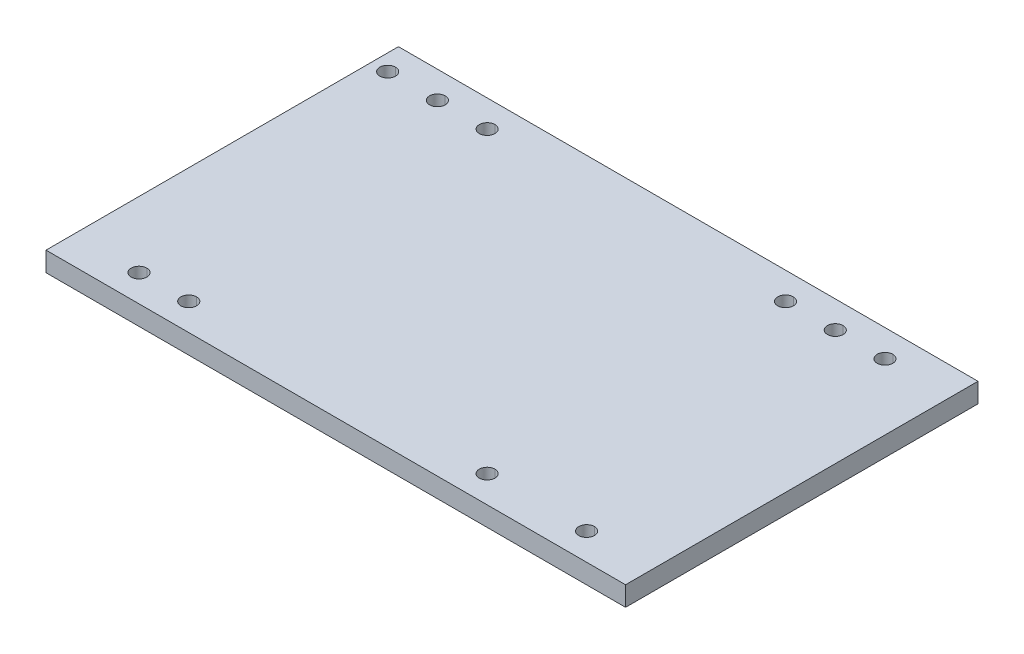
ISO-10303-21;
HEADER;
FILE_DESCRIPTION(('STEP AP214'),'2;1');
FILE_NAME('part.step','',(''),(''),'','','');
FILE_SCHEMA(('AUTOMOTIVE_DESIGN { 1 0 10303 214 1 1 1 1 }'));
ENDSEC;
DATA;
#1=APPLICATION_CONTEXT('core data for automotive mechanical design processes');
#2=APPLICATION_PROTOCOL_DEFINITION('international standard','automotive_design',2000,#1);
#3=PRODUCT_CONTEXT('',#1,'mechanical');
#4=PRODUCT('Part','Part','',(#3));
#5=PRODUCT_RELATED_PRODUCT_CATEGORY('part','',(#4));
#6=PRODUCT_DEFINITION_FORMATION('','',#4);
#7=PRODUCT_DEFINITION_CONTEXT('part definition',#1,'design');
#8=PRODUCT_DEFINITION('design','',#6,#7);
#9=PRODUCT_DEFINITION_SHAPE('','',#8);
#10=(LENGTH_UNIT() NAMED_UNIT(*) SI_UNIT(.MILLI.,.METRE.));
#11=(NAMED_UNIT(*) PLANE_ANGLE_UNIT() SI_UNIT($,.RADIAN.));
#12=(NAMED_UNIT(*) SI_UNIT($,.STERADIAN.) SOLID_ANGLE_UNIT());
#13=UNCERTAINTY_MEASURE_WITH_UNIT(LENGTH_MEASURE(1.E-05),#10,'distance_accuracy_value','');
#14=(GEOMETRIC_REPRESENTATION_CONTEXT(3) GLOBAL_UNCERTAINTY_ASSIGNED_CONTEXT((#13)) GLOBAL_UNIT_ASSIGNED_CONTEXT((#10,
#11,#12)) REPRESENTATION_CONTEXT('',''));
#15=CARTESIAN_POINT('',(0.,0.,0.));
#16=DIRECTION('',(0.,0.,1.));
#17=DIRECTION('',(1.,0.,0.));
#18=AXIS2_PLACEMENT_3D('',#15,#16,#17);
#19=CARTESIAN_POINT('',(-13.97,-9.,-7.62));
#20=DIRECTION('',(0.,1.,0.));
#21=DIRECTION('',(0.,0.,1.));
#22=AXIS2_PLACEMENT_3D('',#19,#20,#21);
#23=CYLINDRICAL_SURFACE('',#22,0.4);
#24=DIRECTION('',(0.,1.,0.));
#25=VECTOR('',#24,1.);
#26=CARTESIAN_POINT('',(-13.97,-9.,-8.02));
#27=LINE('',#26,#25);
#28=CARTESIAN_POINT('',(-13.97,0.,-8.02));
#29=VERTEX_POINT('',#28);
#30=CARTESIAN_POINT('',(-13.97,1.,-8.02));
#31=VERTEX_POINT('',#30);
#32=EDGE_CURVE('E486',#29,#31,#27,.T.);
#33=ORIENTED_EDGE('',*,*,#32,.F.);
#34=CARTESIAN_POINT('',(-13.97,0.,-7.62));
#35=DIRECTION('',(0.,1.,0.));
#36=DIRECTION('',(0.,0.,1.));
#37=AXIS2_PLACEMENT_3D('',#34,#35,#36);
#38=CIRCLE('',#37,0.4);
#39=CARTESIAN_POINT('',(-13.97,0.,-7.22));
#40=VERTEX_POINT('',#39);
#41=EDGE_CURVE('E409',#40,#29,#38,.T.);
#42=ORIENTED_EDGE('',*,*,#41,.F.);
#43=DIRECTION('',(0.,1.,0.));
#44=VECTOR('',#43,1.);
#45=CARTESIAN_POINT('',(-13.97,-9.,-7.22));
#46=LINE('',#45,#44);
#47=CARTESIAN_POINT('',(-13.97,1.,-7.22));
#48=VERTEX_POINT('',#47);
#49=EDGE_CURVE('E494',#40,#48,#46,.T.);
#50=ORIENTED_EDGE('',*,*,#49,.T.);
#51=CARTESIAN_POINT('',(-13.97,1.,-7.62));
#52=DIRECTION('',(0.,1.,0.));
#53=DIRECTION('',(0.,0.,1.));
#54=AXIS2_PLACEMENT_3D('',#51,#52,#53);
#55=CIRCLE('',#54,0.4);
#56=EDGE_CURVE('E20',#48,#31,#55,.T.);
#57=ORIENTED_EDGE('',*,*,#56,.T.);
#58=EDGE_LOOP('',(#33,#42,#50,#57));
#59=FACE_BOUND('',#58,.T.);
#60=ADVANCED_FACE('F17',(#59),#23,.F.);
#61=CARTESIAN_POINT('',(8.89,-9.,-7.62));
#62=DIRECTION('',(0.,1.,0.));
#63=DIRECTION('',(0.,0.,1.));
#64=AXIS2_PLACEMENT_3D('',#61,#62,#63);
#65=CYLINDRICAL_SURFACE('',#64,0.4);
#66=DIRECTION('',(0.,1.,0.));
#67=VECTOR('',#66,1.);
#68=CARTESIAN_POINT('',(8.89,-9.,-8.02));
#69=LINE('',#68,#67);
#70=CARTESIAN_POINT('',(8.89,0.,-8.02));
#71=VERTEX_POINT('',#70);
#72=CARTESIAN_POINT('',(8.89,1.,-8.02));
#73=VERTEX_POINT('',#72);
#74=EDGE_CURVE('E493',#71,#73,#69,.T.);
#75=ORIENTED_EDGE('',*,*,#74,.F.);
#76=CARTESIAN_POINT('',(8.89,0.,-7.62));
#77=DIRECTION('',(0.,1.,0.));
#78=DIRECTION('',(0.,0.,1.));
#79=AXIS2_PLACEMENT_3D('',#76,#77,#78);
#80=CIRCLE('',#79,0.4);
#81=CARTESIAN_POINT('',(8.89,0.,-7.22));
#82=VERTEX_POINT('',#81);
#83=EDGE_CURVE('E412',#82,#71,#80,.T.);
#84=ORIENTED_EDGE('',*,*,#83,.F.);
#85=DIRECTION('',(0.,1.,0.));
#86=VECTOR('',#85,1.);
#87=CARTESIAN_POINT('',(8.89,-9.,-7.22));
#88=LINE('',#87,#86);
#89=CARTESIAN_POINT('',(8.89,1.,-7.22));
#90=VERTEX_POINT('',#89);
#91=EDGE_CURVE('E264',#82,#90,#88,.T.);
#92=ORIENTED_EDGE('',*,*,#91,.T.);
#93=CARTESIAN_POINT('',(8.89,1.,-7.62));
#94=DIRECTION('',(0.,1.,0.));
#95=DIRECTION('',(0.,0.,1.));
#96=AXIS2_PLACEMENT_3D('',#93,#94,#95);
#97=CIRCLE('',#96,0.4);
#98=EDGE_CURVE('E11',#90,#73,#97,.T.);
#99=ORIENTED_EDGE('',*,*,#98,.T.);
#100=EDGE_LOOP('',(#75,#84,#92,#99));
#101=FACE_BOUND('',#100,.T.);
#102=ADVANCED_FACE('F518',(#101),#65,.F.);
#103=CARTESIAN_POINT('',(0.,1.,0.));
#104=DIRECTION('',(0.,1.,0.));
#105=DIRECTION('',(1.,0.,0.));
#106=AXIS2_PLACEMENT_3D('',#103,#104,#105);
#107=PLANE('',#106);
#108=DIRECTION('',(1.,0.,0.));
#109=VECTOR('',#108,1.);
#110=CARTESIAN_POINT('',(14.8,1.,-9.));
#111=LINE('',#110,#109);
#112=CARTESIAN_POINT('',(-14.8,1.,-9.));
#113=VERTEX_POINT('',#112);
#114=CARTESIAN_POINT('',(14.8,1.,-9.));
#115=VERTEX_POINT('',#114);
#116=EDGE_CURVE('E302',#113,#115,#111,.T.);
#117=ORIENTED_EDGE('',*,*,#116,.F.);
#118=DIRECTION('',(0.,0.,-1.));
#119=VECTOR('',#118,1.);
#120=CARTESIAN_POINT('',(-14.8,1.,-9.));
#121=LINE('',#120,#119);
#122=CARTESIAN_POINT('',(-14.8,1.,9.));
#123=VERTEX_POINT('',#122);
#124=EDGE_CURVE('E38',#123,#113,#121,.T.);
#125=ORIENTED_EDGE('',*,*,#124,.F.);
#126=DIRECTION('',(-1.,0.,0.));
#127=VECTOR('',#126,1.);
#128=CARTESIAN_POINT('',(-14.8,1.,9.));
#129=LINE('',#128,#127);
#130=CARTESIAN_POINT('',(14.8,1.,9.));
#131=VERTEX_POINT('',#130);
#132=EDGE_CURVE('E44',#131,#123,#129,.T.);
#133=ORIENTED_EDGE('',*,*,#132,.F.);
#134=DIRECTION('',(0.,0.,1.));
#135=VECTOR('',#134,1.);
#136=CARTESIAN_POINT('',(14.8,1.,9.));
#137=LINE('',#136,#135);
#138=EDGE_CURVE('E452',#115,#131,#137,.T.);
#139=ORIENTED_EDGE('',*,*,#138,.F.);
#140=EDGE_LOOP('',(#117,#125,#133,#139));
#141=FACE_BOUND('',#140,.T.);
#142=CARTESIAN_POINT('',(-11.43,1.,7.62));
#143=DIRECTION('',(0.,-1.,0.));
#144=DIRECTION('',(0.,0.,1.));
#145=AXIS2_PLACEMENT_3D('',#142,#143,#144);
#146=CIRCLE('',#145,0.4);
#147=CARTESIAN_POINT('',(-11.43,1.,8.02));
#148=VERTEX_POINT('',#147);
#149=CARTESIAN_POINT('',(-11.43,1.,7.22));
#150=VERTEX_POINT('',#149);
#151=EDGE_CURVE('E401',#148,#150,#146,.T.);
#152=ORIENTED_EDGE('',*,*,#151,.T.);
#153=CARTESIAN_POINT('',(-11.43,1.,7.62));
#154=DIRECTION('',(0.,-1.,0.));
#155=DIRECTION('',(0.,0.,1.));
#156=AXIS2_PLACEMENT_3D('',#153,#154,#155);
#157=CIRCLE('',#156,0.4);
#158=EDGE_CURVE('E427',#150,#148,#157,.T.);
#159=ORIENTED_EDGE('',*,*,#158,.T.);
#160=EDGE_LOOP('',(#152,#159));
#161=FACE_BOUND('',#160,.T.);
#162=CARTESIAN_POINT('',(-8.89,1.,7.62));
#163=DIRECTION('',(0.,-1.,0.));
#164=DIRECTION('',(0.,0.,1.));
#165=AXIS2_PLACEMENT_3D('',#162,#163,#164);
#166=CIRCLE('',#165,0.4);
#167=CARTESIAN_POINT('',(-8.89,1.,8.02));
#168=VERTEX_POINT('',#167);
#169=CARTESIAN_POINT('',(-8.89,1.,7.22));
#170=VERTEX_POINT('',#169);
#171=EDGE_CURVE('E296',#168,#170,#166,.T.);
#172=ORIENTED_EDGE('',*,*,#171,.T.);
#173=CARTESIAN_POINT('',(-8.89,1.,7.62));
#174=DIRECTION('',(0.,-1.,0.));
#175=DIRECTION('',(0.,0.,1.));
#176=AXIS2_PLACEMENT_3D('',#173,#174,#175);
#177=CIRCLE('',#176,0.4);
#178=EDGE_CURVE('E425',#170,#168,#177,.T.);
#179=ORIENTED_EDGE('',*,*,#178,.T.);
#180=EDGE_LOOP('',(#172,#179));
#181=FACE_BOUND('',#180,.T.);
#182=CARTESIAN_POINT('',(6.35,1.,7.62));
#183=DIRECTION('',(0.,-1.,0.));
#184=DIRECTION('',(0.,0.,1.));
#185=AXIS2_PLACEMENT_3D('',#182,#183,#184);
#186=CIRCLE('',#185,0.4);
#187=CARTESIAN_POINT('',(6.35,1.,8.02));
#188=VERTEX_POINT('',#187);
#189=CARTESIAN_POINT('',(6.35,1.,7.22));
#190=VERTEX_POINT('',#189);
#191=EDGE_CURVE('E376',#188,#190,#186,.T.);
#192=ORIENTED_EDGE('',*,*,#191,.T.);
#193=CARTESIAN_POINT('',(6.35,1.,7.62));
#194=DIRECTION('',(0.,-1.,0.));
#195=DIRECTION('',(0.,0.,1.));
#196=AXIS2_PLACEMENT_3D('',#193,#194,#195);
#197=CIRCLE('',#196,0.4);
#198=EDGE_CURVE('E428',#190,#188,#197,.T.);
#199=ORIENTED_EDGE('',*,*,#198,.T.);
#200=EDGE_LOOP('',(#192,#199));
#201=FACE_BOUND('',#200,.T.);
#202=CARTESIAN_POINT('',(11.43,1.,7.62));
#203=DIRECTION('',(0.,-1.,0.));
#204=DIRECTION('',(0.,0.,1.));
#205=AXIS2_PLACEMENT_3D('',#202,#203,#204);
#206=CIRCLE('',#205,0.4);
#207=CARTESIAN_POINT('',(11.43,1.,8.02));
#208=VERTEX_POINT('',#207);
#209=CARTESIAN_POINT('',(11.43,1.,7.22));
#210=VERTEX_POINT('',#209);
#211=EDGE_CURVE('E357',#208,#210,#206,.T.);
#212=ORIENTED_EDGE('',*,*,#211,.T.);
#213=CARTESIAN_POINT('',(11.43,1.,7.62));
#214=DIRECTION('',(0.,-1.,0.));
#215=DIRECTION('',(0.,0.,1.));
#216=AXIS2_PLACEMENT_3D('',#213,#214,#215);
#217=CIRCLE('',#216,0.4);
#218=EDGE_CURVE('E435',#210,#208,#217,.T.);
#219=ORIENTED_EDGE('',*,*,#218,.T.);
#220=EDGE_LOOP('',(#212,#219));
#221=FACE_BOUND('',#220,.T.);
#222=CARTESIAN_POINT('',(-11.43,1.,-7.62));
#223=DIRECTION('',(0.,-1.,0.));
#224=DIRECTION('',(0.,0.,1.));
#225=AXIS2_PLACEMENT_3D('',#222,#223,#224);
#226=CIRCLE('',#225,0.4);
#227=CARTESIAN_POINT('',(-11.43,1.,-7.22));
#228=VERTEX_POINT('',#227);
#229=CARTESIAN_POINT('',(-11.43,1.,-8.02));
#230=VERTEX_POINT('',#229);
#231=EDGE_CURVE('E338',#228,#230,#226,.T.);
#232=ORIENTED_EDGE('',*,*,#231,.T.);
#233=CARTESIAN_POINT('',(-11.43,1.,-7.62));
#234=DIRECTION('',(0.,-1.,0.));
#235=DIRECTION('',(0.,0.,1.));
#236=AXIS2_PLACEMENT_3D('',#233,#234,#235);
#237=CIRCLE('',#236,0.4);
#238=EDGE_CURVE('E432',#230,#228,#237,.T.);
#239=ORIENTED_EDGE('',*,*,#238,.T.);
#240=EDGE_LOOP('',(#232,#239));
#241=FACE_BOUND('',#240,.T.);
#242=CARTESIAN_POINT('',(-8.89,1.,-7.62));
#243=DIRECTION('',(0.,-1.,0.));
#244=DIRECTION('',(0.,0.,1.));
#245=AXIS2_PLACEMENT_3D('',#242,#243,#244);
#246=CIRCLE('',#245,0.4);
#247=CARTESIAN_POINT('',(-8.89,1.,-7.22));
#248=VERTEX_POINT('',#247);
#249=CARTESIAN_POINT('',(-8.89,1.,-8.02));
#250=VERTEX_POINT('',#249);
#251=EDGE_CURVE('E311',#248,#250,#246,.T.);
#252=ORIENTED_EDGE('',*,*,#251,.T.);
#253=CARTESIAN_POINT('',(-8.89,1.,-7.62));
#254=DIRECTION('',(0.,-1.,0.));
#255=DIRECTION('',(0.,0.,1.));
#256=AXIS2_PLACEMENT_3D('',#253,#254,#255);
#257=CIRCLE('',#256,0.4);
#258=EDGE_CURVE('E241',#250,#248,#257,.T.);
#259=ORIENTED_EDGE('',*,*,#258,.T.);
#260=EDGE_LOOP('',(#252,#259));
#261=FACE_BOUND('',#260,.T.);
#262=CARTESIAN_POINT('',(6.35,1.,-7.62));
#263=DIRECTION('',(0.,-1.,0.));
#264=DIRECTION('',(0.,0.,1.));
#265=AXIS2_PLACEMENT_3D('',#262,#263,#264);
#266=CIRCLE('',#265,0.4);
#267=CARTESIAN_POINT('',(6.35,1.,-7.22));
#268=VERTEX_POINT('',#267);
#269=CARTESIAN_POINT('',(6.35,1.,-8.02));
#270=VERTEX_POINT('',#269);
#271=EDGE_CURVE('E244',#268,#270,#266,.T.);
#272=ORIENTED_EDGE('',*,*,#271,.T.);
#273=CARTESIAN_POINT('',(6.35,1.,-7.62));
#274=DIRECTION('',(0.,-1.,0.));
#275=DIRECTION('',(0.,0.,1.));
#276=AXIS2_PLACEMENT_3D('',#273,#274,#275);
#277=CIRCLE('',#276,0.4);
#278=EDGE_CURVE('E230',#270,#268,#277,.T.);
#279=ORIENTED_EDGE('',*,*,#278,.T.);
#280=EDGE_LOOP('',(#272,#279));
#281=FACE_BOUND('',#280,.T.);
#282=CARTESIAN_POINT('',(11.43,1.,-7.62));
#283=DIRECTION('',(0.,-1.,0.));
#284=DIRECTION('',(0.,0.,1.));
#285=AXIS2_PLACEMENT_3D('',#282,#283,#284);
#286=CIRCLE('',#285,0.4);
#287=CARTESIAN_POINT('',(11.43,1.,-7.22));
#288=VERTEX_POINT('',#287);
#289=CARTESIAN_POINT('',(11.43,1.,-8.02));
#290=VERTEX_POINT('',#289);
#291=EDGE_CURVE('E277',#288,#290,#286,.T.);
#292=ORIENTED_EDGE('',*,*,#291,.T.);
#293=CARTESIAN_POINT('',(11.43,1.,-7.62));
#294=DIRECTION('',(0.,-1.,0.));
#295=DIRECTION('',(0.,0.,1.));
#296=AXIS2_PLACEMENT_3D('',#293,#294,#295);
#297=CIRCLE('',#296,0.4);
#298=EDGE_CURVE('E242',#290,#288,#297,.T.);
#299=ORIENTED_EDGE('',*,*,#298,.T.);
#300=EDGE_LOOP('',(#292,#299));
#301=FACE_BOUND('',#300,.T.);
#302=ORIENTED_EDGE('',*,*,#98,.F.);
#303=CARTESIAN_POINT('',(8.89,1.,-7.62));
#304=DIRECTION('',(0.,1.,0.));
#305=DIRECTION('',(0.,0.,1.));
#306=AXIS2_PLACEMENT_3D('',#303,#304,#305);
#307=CIRCLE('',#306,0.4);
#308=EDGE_CURVE('E269',#73,#90,#307,.T.);
#309=ORIENTED_EDGE('',*,*,#308,.F.);
#310=EDGE_LOOP('',(#302,#309));
#311=FACE_BOUND('',#310,.T.);
#312=ORIENTED_EDGE('',*,*,#56,.F.);
#313=CARTESIAN_POINT('',(-13.97,1.,-7.62));
#314=DIRECTION('',(0.,1.,0.));
#315=DIRECTION('',(0.,0.,1.));
#316=AXIS2_PLACEMENT_3D('',#313,#314,#315);
#317=CIRCLE('',#316,0.4);
#318=EDGE_CURVE('E480',#31,#48,#317,.T.);
#319=ORIENTED_EDGE('',*,*,#318,.F.);
#320=EDGE_LOOP('',(#312,#319));
#321=FACE_BOUND('',#320,.T.);
#322=ADVANCED_FACE('F245',(#141,#161,#181,#201,#221,#241,#261,#281,#301,#311,#321),#107,.T.);
#323=CARTESIAN_POINT('',(-14.8,0.,-9.));
#324=DIRECTION('',(-1.,0.,0.));
#325=DIRECTION('',(0.,0.,1.));
#326=AXIS2_PLACEMENT_3D('',#323,#324,#325);
#327=PLANE('',#326);
#328=DIRECTION('',(0.,1.,0.));
#329=VECTOR('',#328,1.);
#330=CARTESIAN_POINT('',(-14.8,0.,-9.));
#331=LINE('',#330,#329);
#332=CARTESIAN_POINT('',(-14.8,0.,-9.));
#333=VERTEX_POINT('',#332);
#334=EDGE_CURVE('E298',#333,#113,#331,.T.);
#335=ORIENTED_EDGE('',*,*,#334,.F.);
#336=DIRECTION('',(0.,0.,1.));
#337=VECTOR('',#336,1.);
#338=CARTESIAN_POINT('',(-14.8,0.,0.));
#339=LINE('',#338,#337);
#340=CARTESIAN_POINT('',(-14.8,0.,9.));
#341=VERTEX_POINT('',#340);
#342=EDGE_CURVE('E291',#333,#341,#339,.T.);
#343=ORIENTED_EDGE('',*,*,#342,.T.);
#344=DIRECTION('',(0.,-1.,0.));
#345=VECTOR('',#344,1.);
#346=CARTESIAN_POINT('',(-14.8,0.,9.));
#347=LINE('',#346,#345);
#348=EDGE_CURVE('E453',#123,#341,#347,.T.);
#349=ORIENTED_EDGE('',*,*,#348,.F.);
#350=ORIENTED_EDGE('',*,*,#124,.T.);
#351=EDGE_LOOP('',(#335,#343,#349,#350));
#352=FACE_BOUND('',#351,.T.);
#353=ADVANCED_FACE('F463',(#352),#327,.T.);
#354=CARTESIAN_POINT('',(-14.8,0.,9.));
#355=DIRECTION('',(0.,0.,1.));
#356=DIRECTION('',(1.,0.,0.));
#357=AXIS2_PLACEMENT_3D('',#354,#355,#356);
#358=PLANE('',#357);
#359=ORIENTED_EDGE('',*,*,#348,.T.);
#360=DIRECTION('',(1.,0.,0.));
#361=VECTOR('',#360,1.);
#362=CARTESIAN_POINT('',(0.,0.,9.));
#363=LINE('',#362,#361);
#364=CARTESIAN_POINT('',(14.8,0.,9.));
#365=VERTEX_POINT('',#364);
#366=EDGE_CURVE('E282',#341,#365,#363,.T.);
#367=ORIENTED_EDGE('',*,*,#366,.T.);
#368=DIRECTION('',(0.,-1.,0.));
#369=VECTOR('',#368,1.);
#370=CARTESIAN_POINT('',(14.8,0.,9.));
#371=LINE('',#370,#369);
#372=EDGE_CURVE('E445',#131,#365,#371,.T.);
#373=ORIENTED_EDGE('',*,*,#372,.F.);
#374=ORIENTED_EDGE('',*,*,#132,.T.);
#375=EDGE_LOOP('',(#359,#367,#373,#374));
#376=FACE_BOUND('',#375,.T.);
#377=ADVANCED_FACE('F461',(#376),#358,.T.);
#378=CARTESIAN_POINT('',(14.8,0.,9.));
#379=DIRECTION('',(1.,0.,0.));
#380=DIRECTION('',(0.,1.,0.));
#381=AXIS2_PLACEMENT_3D('',#378,#379,#380);
#382=PLANE('',#381);
#383=ORIENTED_EDGE('',*,*,#372,.T.);
#384=DIRECTION('',(0.,0.,-1.));
#385=VECTOR('',#384,1.);
#386=CARTESIAN_POINT('',(14.8,0.,0.));
#387=LINE('',#386,#385);
#388=CARTESIAN_POINT('',(14.8,0.,-9.));
#389=VERTEX_POINT('',#388);
#390=EDGE_CURVE('E278',#365,#389,#387,.T.);
#391=ORIENTED_EDGE('',*,*,#390,.T.);
#392=DIRECTION('',(0.,-1.,0.));
#393=VECTOR('',#392,1.);
#394=CARTESIAN_POINT('',(14.8,0.,-9.));
#395=LINE('',#394,#393);
#396=EDGE_CURVE('E303',#115,#389,#395,.T.);
#397=ORIENTED_EDGE('',*,*,#396,.F.);
#398=ORIENTED_EDGE('',*,*,#138,.T.);
#399=EDGE_LOOP('',(#383,#391,#397,#398));
#400=FACE_BOUND('',#399,.T.);
#401=ADVANCED_FACE('F473',(#400),#382,.T.);
#402=CARTESIAN_POINT('',(14.8,0.,-9.));
#403=DIRECTION('',(0.,0.,-1.));
#404=DIRECTION('',(0.,-1.,0.));
#405=AXIS2_PLACEMENT_3D('',#402,#403,#404);
#406=PLANE('',#405);
#407=ORIENTED_EDGE('',*,*,#396,.T.);
#408=DIRECTION('',(-1.,0.,0.));
#409=VECTOR('',#408,1.);
#410=CARTESIAN_POINT('',(0.,0.,-9.));
#411=LINE('',#410,#409);
#412=EDGE_CURVE('E287',#389,#333,#411,.T.);
#413=ORIENTED_EDGE('',*,*,#412,.T.);
#414=ORIENTED_EDGE('',*,*,#334,.T.);
#415=ORIENTED_EDGE('',*,*,#116,.T.);
#416=EDGE_LOOP('',(#407,#413,#414,#415));
#417=FACE_BOUND('',#416,.T.);
#418=ADVANCED_FACE('F848',(#417),#406,.T.);
#419=CARTESIAN_POINT('',(-11.43,1.,7.62));
#420=DIRECTION('',(0.,1.,0.));
#421=DIRECTION('',(0.,0.,1.));
#422=AXIS2_PLACEMENT_3D('',#419,#420,#421);
#423=CYLINDRICAL_SURFACE('',#422,0.4);
#424=DIRECTION('',(0.,1.,0.));
#425=VECTOR('',#424,1.);
#426=CARTESIAN_POINT('',(-11.43,1.,7.22));
#427=LINE('',#426,#425);
#428=CARTESIAN_POINT('',(-11.43,0.,7.22));
#429=VERTEX_POINT('',#428);
#430=EDGE_CURVE('E390',#429,#150,#427,.T.);
#431=ORIENTED_EDGE('',*,*,#430,.F.);
#432=CARTESIAN_POINT('',(-11.43,0.,7.62));
#433=DIRECTION('',(0.,-1.,0.));
#434=DIRECTION('',(0.,0.,1.));
#435=AXIS2_PLACEMENT_3D('',#432,#433,#434);
#436=CIRCLE('',#435,0.4);
#437=CARTESIAN_POINT('',(-11.43,0.,8.02));
#438=VERTEX_POINT('',#437);
#439=EDGE_CURVE('E283',#429,#438,#436,.T.);
#440=ORIENTED_EDGE('',*,*,#439,.T.);
#441=DIRECTION('',(0.,1.,0.));
#442=VECTOR('',#441,1.);
#443=CARTESIAN_POINT('',(-11.43,1.,8.02));
#444=LINE('',#443,#442);
#445=EDGE_CURVE('E405',#438,#148,#444,.T.);
#446=ORIENTED_EDGE('',*,*,#445,.T.);
#447=ORIENTED_EDGE('',*,*,#158,.F.);
#448=EDGE_LOOP('',(#431,#440,#446,#447));
#449=FACE_BOUND('',#448,.T.);
#450=ADVANCED_FACE('F910',(#449),#423,.F.);
#451=CARTESIAN_POINT('',(-8.89,1.,7.62));
#452=DIRECTION('',(0.,1.,0.));
#453=DIRECTION('',(0.,0.,1.));
#454=AXIS2_PLACEMENT_3D('',#451,#452,#453);
#455=CYLINDRICAL_SURFACE('',#454,0.4);
#456=DIRECTION('',(0.,1.,0.));
#457=VECTOR('',#456,1.);
#458=CARTESIAN_POINT('',(-8.89,1.,7.22));
#459=LINE('',#458,#457);
#460=CARTESIAN_POINT('',(-8.89,0.,7.22));
#461=VERTEX_POINT('',#460);
#462=EDGE_CURVE('E330',#461,#170,#459,.T.);
#463=ORIENTED_EDGE('',*,*,#462,.F.);
#464=CARTESIAN_POINT('',(-8.89,0.,7.62));
#465=DIRECTION('',(0.,-1.,0.));
#466=DIRECTION('',(0.,0.,1.));
#467=AXIS2_PLACEMENT_3D('',#464,#465,#466);
#468=CIRCLE('',#467,0.4);
#469=CARTESIAN_POINT('',(-8.89,0.,8.02));
#470=VERTEX_POINT('',#469);
#471=EDGE_CURVE('E420',#461,#470,#468,.T.);
#472=ORIENTED_EDGE('',*,*,#471,.T.);
#473=DIRECTION('',(0.,1.,0.));
#474=VECTOR('',#473,1.);
#475=CARTESIAN_POINT('',(-8.89,1.,8.02));
#476=LINE('',#475,#474);
#477=EDGE_CURVE('E292',#470,#168,#476,.T.);
#478=ORIENTED_EDGE('',*,*,#477,.T.);
#479=ORIENTED_EDGE('',*,*,#178,.F.);
#480=EDGE_LOOP('',(#463,#472,#478,#479));
#481=FACE_BOUND('',#480,.T.);
#482=ADVANCED_FACE('F901',(#481),#455,.F.);
#483=CARTESIAN_POINT('',(6.35,1.,7.62));
#484=DIRECTION('',(0.,1.,0.));
#485=DIRECTION('',(0.,0.,1.));
#486=AXIS2_PLACEMENT_3D('',#483,#484,#485);
#487=CYLINDRICAL_SURFACE('',#486,0.4);
#488=DIRECTION('',(0.,1.,0.));
#489=VECTOR('',#488,1.);
#490=CARTESIAN_POINT('',(6.35,1.,7.22));
#491=LINE('',#490,#489);
#492=CARTESIAN_POINT('',(6.35,0.,7.22));
#493=VERTEX_POINT('',#492);
#494=EDGE_CURVE('E372',#493,#190,#491,.T.);
#495=ORIENTED_EDGE('',*,*,#494,.F.);
#496=CARTESIAN_POINT('',(6.35,0.,7.62));
#497=DIRECTION('',(0.,-1.,0.));
#498=DIRECTION('',(0.,0.,1.));
#499=AXIS2_PLACEMENT_3D('',#496,#497,#498);
#500=CIRCLE('',#499,0.4);
#501=CARTESIAN_POINT('',(6.35,0.,8.02));
#502=VERTEX_POINT('',#501);
#503=EDGE_CURVE('E397',#493,#502,#500,.T.);
#504=ORIENTED_EDGE('',*,*,#503,.T.);
#505=DIRECTION('',(0.,1.,0.));
#506=VECTOR('',#505,1.);
#507=CARTESIAN_POINT('',(6.35,1.,8.02));
#508=LINE('',#507,#506);
#509=EDGE_CURVE('E380',#502,#188,#508,.T.);
#510=ORIENTED_EDGE('',*,*,#509,.T.);
#511=ORIENTED_EDGE('',*,*,#198,.F.);
#512=EDGE_LOOP('',(#495,#504,#510,#511));
#513=FACE_BOUND('',#512,.T.);
#514=ADVANCED_FACE('F892',(#513),#487,.F.);
#515=CARTESIAN_POINT('',(11.43,1.,7.62));
#516=DIRECTION('',(0.,1.,0.));
#517=DIRECTION('',(0.,0.,1.));
#518=AXIS2_PLACEMENT_3D('',#515,#516,#517);
#519=CYLINDRICAL_SURFACE('',#518,0.4);
#520=DIRECTION('',(0.,1.,0.));
#521=VECTOR('',#520,1.);
#522=CARTESIAN_POINT('',(11.43,1.,7.22));
#523=LINE('',#522,#521);
#524=CARTESIAN_POINT('',(11.43,0.,7.22));
#525=VERTEX_POINT('',#524);
#526=EDGE_CURVE('E356',#525,#210,#523,.T.);
#527=ORIENTED_EDGE('',*,*,#526,.F.);
#528=CARTESIAN_POINT('',(11.43,0.,7.62));
#529=DIRECTION('',(0.,-1.,0.));
#530=DIRECTION('',(0.,0.,1.));
#531=AXIS2_PLACEMENT_3D('',#528,#529,#530);
#532=CIRCLE('',#531,0.4);
#533=CARTESIAN_POINT('',(11.43,0.,8.02));
#534=VERTEX_POINT('',#533);
#535=EDGE_CURVE('E394',#525,#534,#532,.T.);
#536=ORIENTED_EDGE('',*,*,#535,.T.);
#537=DIRECTION('',(0.,1.,0.));
#538=VECTOR('',#537,1.);
#539=CARTESIAN_POINT('',(11.43,1.,8.02));
#540=LINE('',#539,#538);
#541=EDGE_CURVE('E361',#534,#208,#540,.T.);
#542=ORIENTED_EDGE('',*,*,#541,.T.);
#543=ORIENTED_EDGE('',*,*,#218,.F.);
#544=EDGE_LOOP('',(#527,#536,#542,#543));
#545=FACE_BOUND('',#544,.T.);
#546=ADVANCED_FACE('F883',(#545),#519,.F.);
#547=CARTESIAN_POINT('',(-11.43,1.,-7.62));
#548=DIRECTION('',(0.,1.,0.));
#549=DIRECTION('',(0.,0.,1.));
#550=AXIS2_PLACEMENT_3D('',#547,#548,#549);
#551=CYLINDRICAL_SURFACE('',#550,0.4);
#552=DIRECTION('',(0.,1.,0.));
#553=VECTOR('',#552,1.);
#554=CARTESIAN_POINT('',(-11.43,1.,-8.02));
#555=LINE('',#554,#553);
#556=CARTESIAN_POINT('',(-11.43,0.,-8.02));
#557=VERTEX_POINT('',#556);
#558=EDGE_CURVE('E334',#557,#230,#555,.T.);
#559=ORIENTED_EDGE('',*,*,#558,.F.);
#560=CARTESIAN_POINT('',(-11.43,0.,-7.62));
#561=DIRECTION('',(0.,-1.,0.));
#562=DIRECTION('',(0.,0.,1.));
#563=AXIS2_PLACEMENT_3D('',#560,#561,#562);
#564=CIRCLE('',#563,0.4);
#565=CARTESIAN_POINT('',(-11.43,0.,-7.22));
#566=VERTEX_POINT('',#565);
#567=EDGE_CURVE('E263',#557,#566,#564,.T.);
#568=ORIENTED_EDGE('',*,*,#567,.T.);
#569=DIRECTION('',(0.,1.,0.));
#570=VECTOR('',#569,1.);
#571=CARTESIAN_POINT('',(-11.43,1.,-7.22));
#572=LINE('',#571,#570);
#573=EDGE_CURVE('E345',#566,#228,#572,.T.);
#574=ORIENTED_EDGE('',*,*,#573,.T.);
#575=ORIENTED_EDGE('',*,*,#238,.F.);
#576=EDGE_LOOP('',(#559,#568,#574,#575));
#577=FACE_BOUND('',#576,.T.);
#578=ADVANCED_FACE('F818',(#577),#551,.F.);
#579=CARTESIAN_POINT('',(-8.89,1.,-7.62));
#580=DIRECTION('',(0.,1.,0.));
#581=DIRECTION('',(0.,0.,1.));
#582=AXIS2_PLACEMENT_3D('',#579,#580,#581);
#583=CYLINDRICAL_SURFACE('',#582,0.4);
#584=DIRECTION('',(0.,1.,0.));
#585=VECTOR('',#584,1.);
#586=CARTESIAN_POINT('',(-8.89,1.,-8.02));
#587=LINE('',#586,#585);
#588=CARTESIAN_POINT('',(-8.89,0.,-8.02));
#589=VERTEX_POINT('',#588);
#590=EDGE_CURVE('E307',#589,#250,#587,.T.);
#591=ORIENTED_EDGE('',*,*,#590,.F.);
#592=CARTESIAN_POINT('',(-8.89,0.,-7.62));
#593=DIRECTION('',(0.,-1.,0.));
#594=DIRECTION('',(0.,0.,1.));
#595=AXIS2_PLACEMENT_3D('',#592,#593,#594);
#596=CIRCLE('',#595,0.4);
#597=CARTESIAN_POINT('',(-8.89,0.,-7.22));
#598=VERTEX_POINT('',#597);
#599=EDGE_CURVE('E323',#589,#598,#596,.T.);
#600=ORIENTED_EDGE('',*,*,#599,.T.);
#601=DIRECTION('',(0.,1.,0.));
#602=VECTOR('',#601,1.);
#603=CARTESIAN_POINT('',(-8.89,1.,-7.22));
#604=LINE('',#603,#602);
#605=EDGE_CURVE('E315',#598,#248,#604,.T.);
#606=ORIENTED_EDGE('',*,*,#605,.T.);
#607=ORIENTED_EDGE('',*,*,#258,.F.);
#608=EDGE_LOOP('',(#591,#600,#606,#607));
#609=FACE_BOUND('',#608,.T.);
#610=ADVANCED_FACE('F813',(#609),#583,.F.);
#611=CARTESIAN_POINT('',(6.35,1.,-7.62));
#612=DIRECTION('',(0.,1.,0.));
#613=DIRECTION('',(0.,0.,1.));
#614=AXIS2_PLACEMENT_3D('',#611,#612,#613);
#615=CYLINDRICAL_SURFACE('',#614,0.4);
#616=DIRECTION('',(0.,1.,0.));
#617=VECTOR('',#616,1.);
#618=CARTESIAN_POINT('',(6.35,1.,-8.02));
#619=LINE('',#618,#617);
#620=CARTESIAN_POINT('',(6.35,0.,-8.02));
#621=VERTEX_POINT('',#620);
#622=EDGE_CURVE('E234',#621,#270,#619,.T.);
#623=ORIENTED_EDGE('',*,*,#622,.F.);
#624=CARTESIAN_POINT('',(6.35,0.,-7.62));
#625=DIRECTION('',(0.,-1.,0.));
#626=DIRECTION('',(0.,0.,1.));
#627=AXIS2_PLACEMENT_3D('',#624,#625,#626);
#628=CIRCLE('',#627,0.4);
#629=CARTESIAN_POINT('',(6.35,0.,-7.22));
#630=VERTEX_POINT('',#629);
#631=EDGE_CURVE('E326',#621,#630,#628,.T.);
#632=ORIENTED_EDGE('',*,*,#631,.T.);
#633=DIRECTION('',(0.,1.,0.));
#634=VECTOR('',#633,1.);
#635=CARTESIAN_POINT('',(6.35,1.,-7.22));
#636=LINE('',#635,#634);
#637=EDGE_CURVE('E237',#630,#268,#636,.T.);
#638=ORIENTED_EDGE('',*,*,#637,.T.);
#639=ORIENTED_EDGE('',*,*,#278,.F.);
#640=EDGE_LOOP('',(#623,#632,#638,#639));
#641=FACE_BOUND('',#640,.T.);
#642=ADVANCED_FACE('F232',(#641),#615,.F.);
#643=CARTESIAN_POINT('',(11.43,1.,-7.62));
#644=DIRECTION('',(0.,1.,0.));
#645=DIRECTION('',(0.,0.,1.));
#646=AXIS2_PLACEMENT_3D('',#643,#644,#645);
#647=CYLINDRICAL_SURFACE('',#646,0.4);
#648=DIRECTION('',(0.,1.,0.));
#649=VECTOR('',#648,1.);
#650=CARTESIAN_POINT('',(11.43,1.,-8.02));
#651=LINE('',#650,#649);
#652=CARTESIAN_POINT('',(11.43,0.,-8.02));
#653=VERTEX_POINT('',#652);
#654=EDGE_CURVE('E273',#653,#290,#651,.T.);
#655=ORIENTED_EDGE('',*,*,#654,.F.);
#656=CARTESIAN_POINT('',(11.43,0.,-7.62));
#657=DIRECTION('',(0.,-1.,0.));
#658=DIRECTION('',(0.,0.,1.));
#659=AXIS2_PLACEMENT_3D('',#656,#657,#658);
#660=CIRCLE('',#659,0.4);
#661=CARTESIAN_POINT('',(11.43,0.,-7.22));
#662=VERTEX_POINT('',#661);
#663=EDGE_CURVE('E415',#653,#662,#660,.T.);
#664=ORIENTED_EDGE('',*,*,#663,.T.);
#665=DIRECTION('',(0.,1.,0.));
#666=VECTOR('',#665,1.);
#667=CARTESIAN_POINT('',(11.43,1.,-7.22));
#668=LINE('',#667,#666);
#669=EDGE_CURVE('E259',#662,#288,#668,.T.);
#670=ORIENTED_EDGE('',*,*,#669,.T.);
#671=ORIENTED_EDGE('',*,*,#298,.F.);
#672=EDGE_LOOP('',(#655,#664,#670,#671));
#673=FACE_BOUND('',#672,.T.);
#674=ADVANCED_FACE('F769',(#673),#647,.F.);
#675=CARTESIAN_POINT('',(0.,0.,0.));
#676=DIRECTION('',(0.,1.,0.));
#677=DIRECTION('',(1.,0.,0.));
#678=AXIS2_PLACEMENT_3D('',#675,#676,#677);
#679=PLANE('',#678);
#680=ORIENTED_EDGE('',*,*,#390,.F.);
#681=ORIENTED_EDGE('',*,*,#366,.F.);
#682=ORIENTED_EDGE('',*,*,#342,.F.);
#683=ORIENTED_EDGE('',*,*,#412,.F.);
#684=EDGE_LOOP('',(#680,#681,#682,#683));
#685=FACE_BOUND('',#684,.T.);
#686=CARTESIAN_POINT('',(-11.43,0.,7.62));
#687=DIRECTION('',(0.,-1.,0.));
#688=DIRECTION('',(0.,0.,1.));
#689=AXIS2_PLACEMENT_3D('',#686,#687,#688);
#690=CIRCLE('',#689,0.4);
#691=EDGE_CURVE('E295',#438,#429,#690,.T.);
#692=ORIENTED_EDGE('',*,*,#691,.F.);
#693=ORIENTED_EDGE('',*,*,#439,.F.);
#694=EDGE_LOOP('',(#692,#693));
#695=FACE_BOUND('',#694,.T.);
#696=CARTESIAN_POINT('',(-8.89,0.,7.62));
#697=DIRECTION('',(0.,-1.,0.));
#698=DIRECTION('',(0.,0.,1.));
#699=AXIS2_PLACEMENT_3D('',#696,#697,#698);
#700=CIRCLE('',#699,0.4);
#701=EDGE_CURVE('E342',#470,#461,#700,.T.);
#702=ORIENTED_EDGE('',*,*,#701,.F.);
#703=ORIENTED_EDGE('',*,*,#471,.F.);
#704=EDGE_LOOP('',(#702,#703));
#705=FACE_BOUND('',#704,.T.);
#706=CARTESIAN_POINT('',(6.35,0.,7.62));
#707=DIRECTION('',(0.,-1.,0.));
#708=DIRECTION('',(0.,0.,1.));
#709=AXIS2_PLACEMENT_3D('',#706,#707,#708);
#710=CIRCLE('',#709,0.4);
#711=EDGE_CURVE('E368',#502,#493,#710,.T.);
#712=ORIENTED_EDGE('',*,*,#711,.F.);
#713=ORIENTED_EDGE('',*,*,#503,.F.);
#714=EDGE_LOOP('',(#712,#713));
#715=FACE_BOUND('',#714,.T.);
#716=CARTESIAN_POINT('',(11.43,0.,7.62));
#717=DIRECTION('',(0.,-1.,0.));
#718=DIRECTION('',(0.,0.,1.));
#719=AXIS2_PLACEMENT_3D('',#716,#717,#718);
#720=CIRCLE('',#719,0.4);
#721=EDGE_CURVE('E350',#534,#525,#720,.T.);
#722=ORIENTED_EDGE('',*,*,#721,.F.);
#723=ORIENTED_EDGE('',*,*,#535,.F.);
#724=EDGE_LOOP('',(#722,#723));
#725=FACE_BOUND('',#724,.T.);
#726=CARTESIAN_POINT('',(-11.43,0.,-7.62));
#727=DIRECTION('',(0.,-1.,0.));
#728=DIRECTION('',(0.,0.,1.));
#729=AXIS2_PLACEMENT_3D('',#726,#727,#728);
#730=CIRCLE('',#729,0.4);
#731=EDGE_CURVE('E322',#566,#557,#730,.T.);
#732=ORIENTED_EDGE('',*,*,#731,.F.);
#733=ORIENTED_EDGE('',*,*,#567,.F.);
#734=EDGE_LOOP('',(#732,#733));
#735=FACE_BOUND('',#734,.T.);
#736=CARTESIAN_POINT('',(-8.89,0.,-7.62));
#737=DIRECTION('',(0.,-1.,0.));
#738=DIRECTION('',(0.,0.,1.));
#739=AXIS2_PLACEMENT_3D('',#736,#737,#738);
#740=CIRCLE('',#739,0.4);
#741=EDGE_CURVE('E286',#598,#589,#740,.T.);
#742=ORIENTED_EDGE('',*,*,#741,.F.);
#743=ORIENTED_EDGE('',*,*,#599,.F.);
#744=EDGE_LOOP('',(#742,#743));
#745=FACE_BOUND('',#744,.T.);
#746=CARTESIAN_POINT('',(6.35,0.,-7.62));
#747=DIRECTION('',(0.,-1.,0.));
#748=DIRECTION('',(0.,0.,1.));
#749=AXIS2_PLACEMENT_3D('',#746,#747,#748);
#750=CIRCLE('',#749,0.4);
#751=EDGE_CURVE('E252',#630,#621,#750,.T.);
#752=ORIENTED_EDGE('',*,*,#751,.F.);
#753=ORIENTED_EDGE('',*,*,#631,.F.);
#754=EDGE_LOOP('',(#752,#753));
#755=FACE_BOUND('',#754,.T.);
#756=CARTESIAN_POINT('',(11.43,0.,-7.62));
#757=DIRECTION('',(0.,-1.,0.));
#758=DIRECTION('',(0.,0.,1.));
#759=AXIS2_PLACEMENT_3D('',#756,#757,#758);
#760=CIRCLE('',#759,0.4);
#761=EDGE_CURVE('E268',#662,#653,#760,.T.);
#762=ORIENTED_EDGE('',*,*,#761,.F.);
#763=ORIENTED_EDGE('',*,*,#663,.F.);
#764=EDGE_LOOP('',(#762,#763));
#765=FACE_BOUND('',#764,.T.);
#766=ORIENTED_EDGE('',*,*,#83,.T.);
#767=CARTESIAN_POINT('',(8.89,0.,-7.62));
#768=DIRECTION('',(0.,1.,0.));
#769=DIRECTION('',(0.,0.,1.));
#770=AXIS2_PLACEMENT_3D('',#767,#768,#769);
#771=CIRCLE('',#770,0.4);
#772=EDGE_CURVE('E498',#71,#82,#771,.T.);
#773=ORIENTED_EDGE('',*,*,#772,.T.);
#774=EDGE_LOOP('',(#766,#773));
#775=FACE_BOUND('',#774,.T.);
#776=ORIENTED_EDGE('',*,*,#41,.T.);
#777=CARTESIAN_POINT('',(-13.97,0.,-7.62));
#778=DIRECTION('',(0.,1.,0.));
#779=DIRECTION('',(0.,0.,1.));
#780=AXIS2_PLACEMENT_3D('',#777,#778,#779);
#781=CIRCLE('',#780,0.4);
#782=EDGE_CURVE('E482',#29,#40,#781,.T.);
#783=ORIENTED_EDGE('',*,*,#782,.T.);
#784=EDGE_LOOP('',(#776,#783));
#785=FACE_BOUND('',#784,.T.);
#786=ADVANCED_FACE('F469',(#685,#695,#705,#715,#725,#735,#745,#755,#765,#775,#785),#679,.F.);
#787=CARTESIAN_POINT('',(-11.43,1.,7.62));
#788=DIRECTION('',(0.,1.,0.));
#789=DIRECTION('',(0.,0.,1.));
#790=AXIS2_PLACEMENT_3D('',#787,#788,#789);
#791=CYLINDRICAL_SURFACE('',#790,0.4);
#792=ORIENTED_EDGE('',*,*,#691,.T.);
#793=ORIENTED_EDGE('',*,*,#430,.T.);
#794=ORIENTED_EDGE('',*,*,#151,.F.);
#795=ORIENTED_EDGE('',*,*,#445,.F.);
#796=EDGE_LOOP('',(#792,#793,#794,#795));
#797=FACE_BOUND('',#796,.T.);
#798=ADVANCED_FACE('F824',(#797),#791,.F.);
#799=CARTESIAN_POINT('',(-8.89,1.,7.62));
#800=DIRECTION('',(0.,1.,0.));
#801=DIRECTION('',(0.,0.,1.));
#802=AXIS2_PLACEMENT_3D('',#799,#800,#801);
#803=CYLINDRICAL_SURFACE('',#802,0.4);
#804=ORIENTED_EDGE('',*,*,#701,.T.);
#805=ORIENTED_EDGE('',*,*,#462,.T.);
#806=ORIENTED_EDGE('',*,*,#171,.F.);
#807=ORIENTED_EDGE('',*,*,#477,.F.);
#808=EDGE_LOOP('',(#804,#805,#806,#807));
#809=FACE_BOUND('',#808,.T.);
#810=ADVANCED_FACE('F829',(#809),#803,.F.);
#811=CARTESIAN_POINT('',(6.35,1.,7.62));
#812=DIRECTION('',(0.,1.,0.));
#813=DIRECTION('',(0.,0.,1.));
#814=AXIS2_PLACEMENT_3D('',#811,#812,#813);
#815=CYLINDRICAL_SURFACE('',#814,0.4);
#816=ORIENTED_EDGE('',*,*,#711,.T.);
#817=ORIENTED_EDGE('',*,*,#494,.T.);
#818=ORIENTED_EDGE('',*,*,#191,.F.);
#819=ORIENTED_EDGE('',*,*,#509,.F.);
#820=EDGE_LOOP('',(#816,#817,#818,#819));
#821=FACE_BOUND('',#820,.T.);
#822=ADVANCED_FACE('F838',(#821),#815,.F.);
#823=CARTESIAN_POINT('',(11.43,1.,7.62));
#824=DIRECTION('',(0.,1.,0.));
#825=DIRECTION('',(0.,0.,1.));
#826=AXIS2_PLACEMENT_3D('',#823,#824,#825);
#827=CYLINDRICAL_SURFACE('',#826,0.4);
#828=ORIENTED_EDGE('',*,*,#721,.T.);
#829=ORIENTED_EDGE('',*,*,#526,.T.);
#830=ORIENTED_EDGE('',*,*,#211,.F.);
#831=ORIENTED_EDGE('',*,*,#541,.F.);
#832=EDGE_LOOP('',(#828,#829,#830,#831));
#833=FACE_BOUND('',#832,.T.);
#834=ADVANCED_FACE('F807',(#833),#827,.F.);
#835=CARTESIAN_POINT('',(-11.43,1.,-7.62));
#836=DIRECTION('',(0.,1.,0.));
#837=DIRECTION('',(0.,0.,1.));
#838=AXIS2_PLACEMENT_3D('',#835,#836,#837);
#839=CYLINDRICAL_SURFACE('',#838,0.4);
#840=ORIENTED_EDGE('',*,*,#731,.T.);
#841=ORIENTED_EDGE('',*,*,#558,.T.);
#842=ORIENTED_EDGE('',*,*,#231,.F.);
#843=ORIENTED_EDGE('',*,*,#573,.F.);
#844=EDGE_LOOP('',(#840,#841,#842,#843));
#845=FACE_BOUND('',#844,.T.);
#846=ADVANCED_FACE('F798',(#845),#839,.F.);
#847=CARTESIAN_POINT('',(-8.89,1.,-7.62));
#848=DIRECTION('',(0.,1.,0.));
#849=DIRECTION('',(0.,0.,1.));
#850=AXIS2_PLACEMENT_3D('',#847,#848,#849);
#851=CYLINDRICAL_SURFACE('',#850,0.4);
#852=ORIENTED_EDGE('',*,*,#741,.T.);
#853=ORIENTED_EDGE('',*,*,#590,.T.);
#854=ORIENTED_EDGE('',*,*,#251,.F.);
#855=ORIENTED_EDGE('',*,*,#605,.F.);
#856=EDGE_LOOP('',(#852,#853,#854,#855));
#857=FACE_BOUND('',#856,.T.);
#858=ADVANCED_FACE('F790',(#857),#851,.F.);
#859=CARTESIAN_POINT('',(6.35,1.,-7.62));
#860=DIRECTION('',(0.,1.,0.));
#861=DIRECTION('',(0.,0.,1.));
#862=AXIS2_PLACEMENT_3D('',#859,#860,#861);
#863=CYLINDRICAL_SURFACE('',#862,0.4);
#864=ORIENTED_EDGE('',*,*,#751,.T.);
#865=ORIENTED_EDGE('',*,*,#622,.T.);
#866=ORIENTED_EDGE('',*,*,#271,.F.);
#867=ORIENTED_EDGE('',*,*,#637,.F.);
#868=EDGE_LOOP('',(#864,#865,#866,#867));
#869=FACE_BOUND('',#868,.T.);
#870=ADVANCED_FACE('F250',(#869),#863,.F.);
#871=CARTESIAN_POINT('',(11.43,1.,-7.62));
#872=DIRECTION('',(0.,1.,0.));
#873=DIRECTION('',(0.,0.,1.));
#874=AXIS2_PLACEMENT_3D('',#871,#872,#873);
#875=CYLINDRICAL_SURFACE('',#874,0.4);
#876=ORIENTED_EDGE('',*,*,#761,.T.);
#877=ORIENTED_EDGE('',*,*,#654,.T.);
#878=ORIENTED_EDGE('',*,*,#291,.F.);
#879=ORIENTED_EDGE('',*,*,#669,.F.);
#880=EDGE_LOOP('',(#876,#877,#878,#879));
#881=FACE_BOUND('',#880,.T.);
#882=ADVANCED_FACE('F762',(#881),#875,.F.);
#883=CARTESIAN_POINT('',(8.89,-9.,-7.62));
#884=DIRECTION('',(0.,1.,0.));
#885=DIRECTION('',(0.,0.,1.));
#886=AXIS2_PLACEMENT_3D('',#883,#884,#885);
#887=CYLINDRICAL_SURFACE('',#886,0.4);
#888=ORIENTED_EDGE('',*,*,#772,.F.);
#889=ORIENTED_EDGE('',*,*,#74,.T.);
#890=ORIENTED_EDGE('',*,*,#308,.T.);
#891=ORIENTED_EDGE('',*,*,#91,.F.);
#892=EDGE_LOOP('',(#888,#889,#890,#891));
#893=FACE_BOUND('',#892,.T.);
#894=ADVANCED_FACE('F514',(#893),#887,.F.);
#895=CARTESIAN_POINT('',(-13.97,-9.,-7.62));
#896=DIRECTION('',(0.,1.,0.));
#897=DIRECTION('',(0.,0.,1.));
#898=AXIS2_PLACEMENT_3D('',#895,#896,#897);
#899=CYLINDRICAL_SURFACE('',#898,0.4);
#900=ORIENTED_EDGE('',*,*,#782,.F.);
#901=ORIENTED_EDGE('',*,*,#32,.T.);
#902=ORIENTED_EDGE('',*,*,#318,.T.);
#903=ORIENTED_EDGE('',*,*,#49,.F.);
#904=EDGE_LOOP('',(#900,#901,#902,#903));
#905=FACE_BOUND('',#904,.T.);
#906=ADVANCED_FACE('F531',(#905),#899,.F.);
#907=CLOSED_SHELL('',(#60,#102,#322,#353,#377,#401,#418,#450,#482,#514,#546,#578,#610,#642,#674,
#786,#798,#810,#822,#834,#846,#858,#870,#882,#894,#906));
#908=MANIFOLD_SOLID_BREP('B1',#907);
#909=ADVANCED_BREP_SHAPE_REPRESENTATION('',(#18,#908),#14);
#910=SHAPE_DEFINITION_REPRESENTATION(#9,#909);
ENDSEC;
END-ISO-10303-21;
